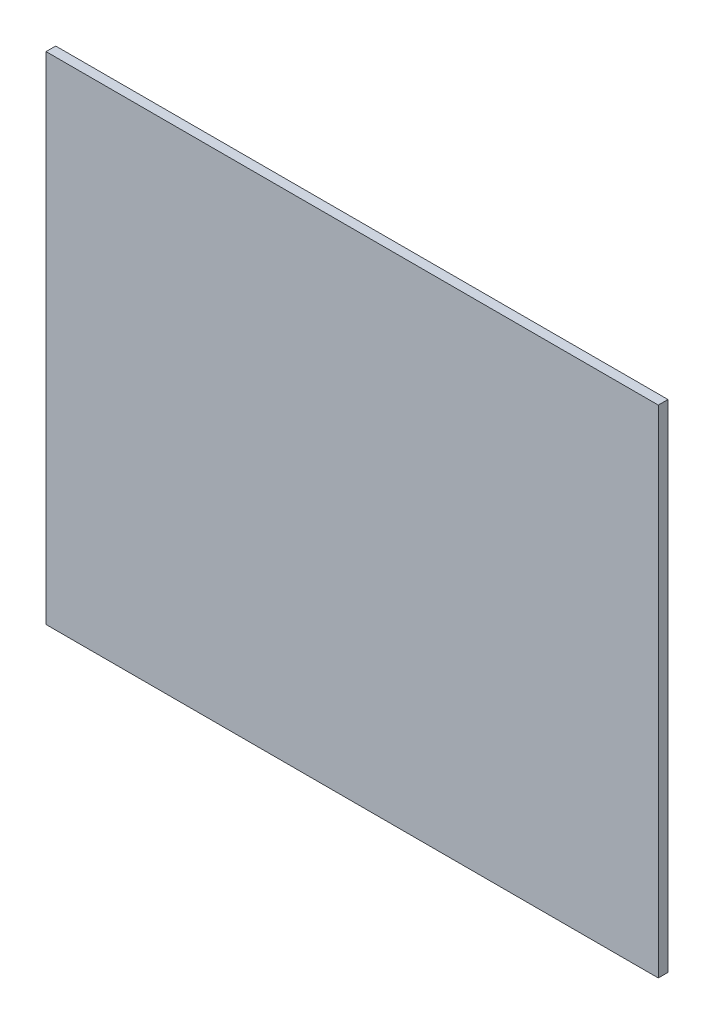
ISO-10303-21;
HEADER;
FILE_DESCRIPTION(('STEP AP214'),'2;1');
FILE_NAME('part.step','',(''),(''),'','','');
FILE_SCHEMA(('AUTOMOTIVE_DESIGN { 1 0 10303 214 1 1 1 1 }'));
ENDSEC;
DATA;
#1=APPLICATION_CONTEXT('core data for automotive mechanical design processes');
#2=APPLICATION_PROTOCOL_DEFINITION('international standard','automotive_design',2000,#1);
#3=PRODUCT_CONTEXT('',#1,'mechanical');
#4=PRODUCT('Part','Part','',(#3));
#5=PRODUCT_RELATED_PRODUCT_CATEGORY('part','',(#4));
#6=PRODUCT_DEFINITION_FORMATION('','',#4);
#7=PRODUCT_DEFINITION_CONTEXT('part definition',#1,'design');
#8=PRODUCT_DEFINITION('design','',#6,#7);
#9=PRODUCT_DEFINITION_SHAPE('','',#8);
#10=(LENGTH_UNIT() NAMED_UNIT(*) SI_UNIT(.MILLI.,.METRE.));
#11=(NAMED_UNIT(*) PLANE_ANGLE_UNIT() SI_UNIT($,.RADIAN.));
#12=(NAMED_UNIT(*) SI_UNIT($,.STERADIAN.) SOLID_ANGLE_UNIT());
#13=UNCERTAINTY_MEASURE_WITH_UNIT(LENGTH_MEASURE(1.E-05),#10,'distance_accuracy_value','');
#14=(GEOMETRIC_REPRESENTATION_CONTEXT(3) GLOBAL_UNCERTAINTY_ASSIGNED_CONTEXT((#13)) GLOBAL_UNIT_ASSIGNED_CONTEXT((#10,
#11,#12)) REPRESENTATION_CONTEXT('',''));
#15=CARTESIAN_POINT('',(0.,0.,0.));
#16=DIRECTION('',(0.,0.,1.));
#17=DIRECTION('',(1.,0.,0.));
#18=AXIS2_PLACEMENT_3D('',#15,#16,#17);
#19=CARTESIAN_POINT('',(-32.3159325210872,17.6007497656982,1.));
#20=DIRECTION('',(1.,0.,0.));
#21=DIRECTION('',(0.,1.,0.));
#22=AXIS2_PLACEMENT_3D('',#19,#20,#21);
#23=PLANE('',#22);
#24=DIRECTION('',(0.,-1.,0.));
#25=VECTOR('',#24,1.);
#26=CARTESIAN_POINT('',(-32.3159325210872,17.6007497656982,0.));
#27=LINE('',#26,#25);
#28=CARTESIAN_POINT('',(-32.3159325210872,17.6007497656982,0.));
#29=VERTEX_POINT('',#28);
#30=CARTESIAN_POINT('',(-32.3159325210872,-33.6992502343018,0.));
#31=VERTEX_POINT('',#30);
#32=EDGE_CURVE('E107',#29,#31,#27,.T.);
#33=ORIENTED_EDGE('',*,*,#32,.T.);
#34=DIRECTION('',(0.,0.,-1.));
#35=VECTOR('',#34,1.);
#36=CARTESIAN_POINT('',(-32.3159325210872,-33.6992502343018,1.));
#37=LINE('',#36,#35);
#38=CARTESIAN_POINT('',(-32.3159325210872,-33.6992502343018,1.));
#39=VERTEX_POINT('',#38);
#40=EDGE_CURVE('E11',#39,#31,#37,.T.);
#41=ORIENTED_EDGE('',*,*,#40,.F.);
#42=DIRECTION('',(0.,-1.,0.));
#43=VECTOR('',#42,1.);
#44=CARTESIAN_POINT('',(-32.3159325210872,17.6007497656982,1.));
#45=LINE('',#44,#43);
#46=CARTESIAN_POINT('',(-32.3159325210872,17.6007497656982,1.));
#47=VERTEX_POINT('',#46);
#48=EDGE_CURVE('E91',#47,#39,#45,.T.);
#49=ORIENTED_EDGE('',*,*,#48,.F.);
#50=DIRECTION('',(0.,0.,-1.));
#51=VECTOR('',#50,1.);
#52=CARTESIAN_POINT('',(-32.3159325210872,17.6007497656982,1.));
#53=LINE('',#52,#51);
#54=EDGE_CURVE('E103',#47,#29,#53,.T.);
#55=ORIENTED_EDGE('',*,*,#54,.T.);
#56=EDGE_LOOP('',(#33,#41,#49,#55));
#57=FACE_BOUND('',#56,.T.);
#58=ADVANCED_FACE('F39',(#57),#23,.F.);
#59=CARTESIAN_POINT('',(-32.3159325210872,-33.6992502343018,1.));
#60=DIRECTION('',(0.,1.,0.));
#61=DIRECTION('',(0.,0.,1.));
#62=AXIS2_PLACEMENT_3D('',#59,#60,#61);
#63=PLANE('',#62);
#64=DIRECTION('',(1.,0.,0.));
#65=VECTOR('',#64,1.);
#66=CARTESIAN_POINT('',(-32.3159325210872,-33.6992502343018,0.));
#67=LINE('',#66,#65);
#68=CARTESIAN_POINT('',(30.9840674789128,-33.6992502343018,0.));
#69=VERTEX_POINT('',#68);
#70=EDGE_CURVE('E96',#31,#69,#67,.T.);
#71=ORIENTED_EDGE('',*,*,#70,.T.);
#72=DIRECTION('',(0.,0.,-1.));
#73=VECTOR('',#72,1.);
#74=CARTESIAN_POINT('',(30.9840674789128,-33.6992502343018,1.));
#75=LINE('',#74,#73);
#76=CARTESIAN_POINT('',(30.9840674789128,-33.6992502343018,1.));
#77=VERTEX_POINT('',#76);
#78=EDGE_CURVE('E48',#77,#69,#75,.T.);
#79=ORIENTED_EDGE('',*,*,#78,.F.);
#80=DIRECTION('',(1.,0.,0.));
#81=VECTOR('',#80,1.);
#82=CARTESIAN_POINT('',(-32.3159325210872,-33.6992502343018,1.));
#83=LINE('',#82,#81);
#84=EDGE_CURVE('E86',#39,#77,#83,.T.);
#85=ORIENTED_EDGE('',*,*,#84,.F.);
#86=ORIENTED_EDGE('',*,*,#40,.T.);
#87=EDGE_LOOP('',(#71,#79,#85,#86));
#88=FACE_BOUND('',#87,.T.);
#89=ADVANCED_FACE('F95',(#88),#63,.F.);
#90=CARTESIAN_POINT('',(30.9840674789128,17.6007497656982,1.));
#91=DIRECTION('',(-1.,0.,0.));
#92=DIRECTION('',(0.,-1.,0.));
#93=AXIS2_PLACEMENT_3D('',#90,#91,#92);
#94=PLANE('',#93);
#95=DIRECTION('',(0.,1.,0.));
#96=VECTOR('',#95,1.);
#97=CARTESIAN_POINT('',(30.9840674789128,17.6007497656982,0.));
#98=LINE('',#97,#96);
#99=CARTESIAN_POINT('',(30.9840674789128,17.6007497656982,0.));
#100=VERTEX_POINT('',#99);
#101=EDGE_CURVE('E73',#69,#100,#98,.T.);
#102=ORIENTED_EDGE('',*,*,#101,.T.);
#103=DIRECTION('',(0.,0.,-1.));
#104=VECTOR('',#103,1.);
#105=CARTESIAN_POINT('',(30.9840674789128,17.6007497656982,1.));
#106=LINE('',#105,#104);
#107=CARTESIAN_POINT('',(30.9840674789128,17.6007497656982,1.));
#108=VERTEX_POINT('',#107);
#109=EDGE_CURVE('E98',#108,#100,#106,.T.);
#110=ORIENTED_EDGE('',*,*,#109,.F.);
#111=DIRECTION('',(0.,1.,0.));
#112=VECTOR('',#111,1.);
#113=CARTESIAN_POINT('',(30.9840674789128,17.6007497656982,1.));
#114=LINE('',#113,#112);
#115=EDGE_CURVE('E89',#77,#108,#114,.T.);
#116=ORIENTED_EDGE('',*,*,#115,.F.);
#117=ORIENTED_EDGE('',*,*,#78,.T.);
#118=EDGE_LOOP('',(#102,#110,#116,#117));
#119=FACE_BOUND('',#118,.T.);
#120=ADVANCED_FACE('F99',(#119),#94,.F.);
#121=CARTESIAN_POINT('',(-32.3159325210872,17.6007497656982,1.));
#122=DIRECTION('',(0.,-1.,0.));
#123=DIRECTION('',(0.,0.,-1.));
#124=AXIS2_PLACEMENT_3D('',#121,#122,#123);
#125=PLANE('',#124);
#126=DIRECTION('',(-1.,0.,0.));
#127=VECTOR('',#126,1.);
#128=CARTESIAN_POINT('',(-32.3159325210872,17.6007497656982,0.));
#129=LINE('',#128,#127);
#130=EDGE_CURVE('E79',#100,#29,#129,.T.);
#131=ORIENTED_EDGE('',*,*,#130,.T.);
#132=ORIENTED_EDGE('',*,*,#54,.F.);
#133=DIRECTION('',(-1.,0.,0.));
#134=VECTOR('',#133,1.);
#135=CARTESIAN_POINT('',(-32.3159325210872,17.6007497656982,1.));
#136=LINE('',#135,#134);
#137=EDGE_CURVE('E56',#108,#47,#136,.T.);
#138=ORIENTED_EDGE('',*,*,#137,.F.);
#139=ORIENTED_EDGE('',*,*,#109,.T.);
#140=EDGE_LOOP('',(#131,#132,#138,#139));
#141=FACE_BOUND('',#140,.T.);
#142=ADVANCED_FACE('F120',(#141),#125,.F.);
#143=CARTESIAN_POINT('',(0.,0.,1.));
#144=DIRECTION('',(0.,0.,1.));
#145=DIRECTION('',(1.,0.,0.));
#146=AXIS2_PLACEMENT_3D('',#143,#144,#145);
#147=PLANE('',#146);
#148=ORIENTED_EDGE('',*,*,#48,.T.);
#149=ORIENTED_EDGE('',*,*,#84,.T.);
#150=ORIENTED_EDGE('',*,*,#115,.T.);
#151=ORIENTED_EDGE('',*,*,#137,.T.);
#152=EDGE_LOOP('',(#148,#149,#150,#151));
#153=FACE_BOUND('',#152,.T.);
#154=ADVANCED_FACE('F87',(#153),#147,.T.);
#155=CARTESIAN_POINT('',(0.,0.,0.));
#156=DIRECTION('',(0.,0.,1.));
#157=DIRECTION('',(1.,0.,0.));
#158=AXIS2_PLACEMENT_3D('',#155,#156,#157);
#159=PLANE('',#158);
#160=ORIENTED_EDGE('',*,*,#32,.F.);
#161=ORIENTED_EDGE('',*,*,#130,.F.);
#162=ORIENTED_EDGE('',*,*,#101,.F.);
#163=ORIENTED_EDGE('',*,*,#70,.F.);
#164=EDGE_LOOP('',(#160,#161,#162,#163));
#165=FACE_BOUND('',#164,.T.);
#166=ADVANCED_FACE('F123',(#165),#159,.F.);
#167=CLOSED_SHELL('',(#58,#89,#120,#142,#154,#166));
#168=MANIFOLD_SOLID_BREP('B2',#167);
#169=ADVANCED_BREP_SHAPE_REPRESENTATION('',(#18,#168),#14);
#170=SHAPE_DEFINITION_REPRESENTATION(#9,#169);
ENDSEC;
END-ISO-10303-21;
